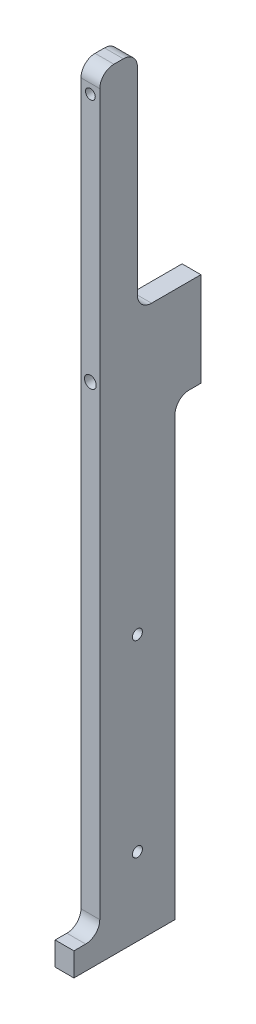
ISO-10303-21;
HEADER;
FILE_DESCRIPTION(('STEP AP214'),'2;1');
FILE_NAME('part.step','',(''),(''),'','','');
FILE_SCHEMA(('AUTOMOTIVE_DESIGN { 1 0 10303 214 1 1 1 1 }'));
ENDSEC;
DATA;
#1=APPLICATION_CONTEXT('core data for automotive mechanical design processes');
#2=APPLICATION_PROTOCOL_DEFINITION('international standard','automotive_design',2000,#1);
#3=PRODUCT_CONTEXT('',#1,'mechanical');
#4=PRODUCT('Part','Part','',(#3));
#5=PRODUCT_RELATED_PRODUCT_CATEGORY('part','',(#4));
#6=PRODUCT_DEFINITION_FORMATION('','',#4);
#7=PRODUCT_DEFINITION_CONTEXT('part definition',#1,'design');
#8=PRODUCT_DEFINITION('design','',#6,#7);
#9=PRODUCT_DEFINITION_SHAPE('','',#8);
#10=(LENGTH_UNIT() NAMED_UNIT(*) SI_UNIT(.MILLI.,.METRE.));
#11=(NAMED_UNIT(*) PLANE_ANGLE_UNIT() SI_UNIT($,.RADIAN.));
#12=(NAMED_UNIT(*) SI_UNIT($,.STERADIAN.) SOLID_ANGLE_UNIT());
#13=UNCERTAINTY_MEASURE_WITH_UNIT(LENGTH_MEASURE(1.E-05),#10,'distance_accuracy_value','');
#14=(GEOMETRIC_REPRESENTATION_CONTEXT(3) GLOBAL_UNCERTAINTY_ASSIGNED_CONTEXT((#13)) GLOBAL_UNIT_ASSIGNED_CONTEXT((#10,
#11,#12)) REPRESENTATION_CONTEXT('',''));
#15=CARTESIAN_POINT('',(0.,0.,0.));
#16=DIRECTION('',(0.,0.,1.));
#17=DIRECTION('',(1.,0.,0.));
#18=AXIS2_PLACEMENT_3D('',#15,#16,#17);
#19=CARTESIAN_POINT('',(6.35,336.55,-42.8625));
#20=DIRECTION('',(0.,0.,-1.));
#21=DIRECTION('',(-1.,0.,0.));
#22=AXIS2_PLACEMENT_3D('',#19,#20,#21);
#23=CYLINDRICAL_SURFACE('',#22,3.96875);
#24=CARTESIAN_POINT('',(6.35,336.55,25.4));
#25=DIRECTION('',(0.,0.,-1.));
#26=DIRECTION('',(-1.,0.,0.));
#27=AXIS2_PLACEMENT_3D('',#24,#25,#26);
#28=CIRCLE('',#27,3.96875);
#29=CARTESIAN_POINT('',(2.38125,336.55,25.4));
#30=VERTEX_POINT('',#29);
#31=EDGE_CURVE('E178',#30,#30,#28,.T.);
#32=ORIENTED_EDGE('',*,*,#31,.F.);
#33=EDGE_LOOP('',(#32));
#34=FACE_BOUND('',#33,.T.);
#35=CARTESIAN_POINT('',(6.35,336.55,-42.8625));
#36=DIRECTION('',(0.,0.,-1.));
#37=DIRECTION('',(-1.,0.,0.));
#38=AXIS2_PLACEMENT_3D('',#35,#36,#37);
#39=CIRCLE('',#38,3.96875);
#40=CARTESIAN_POINT('',(2.38125,336.55,-42.8625));
#41=VERTEX_POINT('',#40);
#42=EDGE_CURVE('E136',#41,#41,#39,.F.);
#43=ORIENTED_EDGE('',*,*,#42,.F.);
#44=EDGE_LOOP('',(#43));
#45=FACE_BOUND('',#44,.T.);
#46=ADVANCED_FACE('F16',(#34,#45),#23,.F.);
#47=CARTESIAN_POINT('',(6.35,504.825,0.));
#48=DIRECTION('',(0.,0.,1.));
#49=DIRECTION('',(1.,0.,0.));
#50=AXIS2_PLACEMENT_3D('',#47,#48,#49);
#51=CYLINDRICAL_SURFACE('',#50,3.302);
#52=CARTESIAN_POINT('',(6.35,504.825,25.4));
#53=DIRECTION('',(0.,0.,1.));
#54=DIRECTION('',(1.,0.,0.));
#55=AXIS2_PLACEMENT_3D('',#52,#53,#54);
#56=CIRCLE('',#55,3.302);
#57=CARTESIAN_POINT('',(9.652,504.825,25.4));
#58=VERTEX_POINT('',#57);
#59=EDGE_CURVE('E221',#58,#58,#56,.F.);
#60=ORIENTED_EDGE('',*,*,#59,.F.);
#61=EDGE_LOOP('',(#60));
#62=FACE_BOUND('',#61,.T.);
#63=CARTESIAN_POINT('',(6.35,504.825,0.));
#64=DIRECTION('',(0.,0.,1.));
#65=DIRECTION('',(1.,0.,0.));
#66=AXIS2_PLACEMENT_3D('',#63,#64,#65);
#67=CIRCLE('',#66,3.302);
#68=CARTESIAN_POINT('',(9.652,504.825,0.));
#69=VERTEX_POINT('',#68);
#70=EDGE_CURVE('E209',#69,#69,#67,.T.);
#71=ORIENTED_EDGE('',*,*,#70,.F.);
#72=EDGE_LOOP('',(#71));
#73=FACE_BOUND('',#72,.T.);
#74=ADVANCED_FACE('F231',(#62,#73),#51,.F.);
#75=CARTESIAN_POINT('',(12.7,0.,0.));
#76=DIRECTION('',(1.,0.,0.));
#77=DIRECTION('',(0.,0.,-1.));
#78=AXIS2_PLACEMENT_3D('',#75,#76,#77);
#79=PLANE('',#78);
#80=CARTESIAN_POINT('',(12.7,52.3875,0.));
#81=DIRECTION('',(1.,0.,0.));
#82=DIRECTION('',(0.,0.,-1.));
#83=AXIS2_PLACEMENT_3D('',#80,#81,#82);
#84=CIRCLE('',#83,3.3655);
#85=CARTESIAN_POINT('',(12.7,52.3875,-3.3655));
#86=VERTEX_POINT('',#85);
#87=EDGE_CURVE('E201',#86,#86,#84,.F.);
#88=ORIENTED_EDGE('',*,*,#87,.T.);
#89=EDGE_LOOP('',(#88));
#90=FACE_BOUND('',#89,.T.);
#91=CARTESIAN_POINT('',(12.7,179.3875,0.));
#92=DIRECTION('',(1.,0.,0.));
#93=DIRECTION('',(0.,0.,-1.));
#94=AXIS2_PLACEMENT_3D('',#91,#92,#93);
#95=CIRCLE('',#94,3.3655);
#96=CARTESIAN_POINT('',(12.7,179.3875,-3.3655));
#97=VERTEX_POINT('',#96);
#98=EDGE_CURVE('E204',#97,#97,#95,.F.);
#99=ORIENTED_EDGE('',*,*,#98,.T.);
#100=EDGE_LOOP('',(#99));
#101=FACE_BOUND('',#100,.T.);
#102=CARTESIAN_POINT('',(12.7,377.825,-9.525));
#103=DIRECTION('',(-1.,0.,0.));
#104=DIRECTION('',(0.,0.,1.));
#105=AXIS2_PLACEMENT_3D('',#102,#103,#104);
#106=CIRCLE('',#105,9.525);
#107=CARTESIAN_POINT('',(12.7,368.3,-9.525));
#108=VERTEX_POINT('',#107);
#109=CARTESIAN_POINT('',(12.7,377.825,0.));
#110=VERTEX_POINT('',#109);
#111=EDGE_CURVE('E212',#108,#110,#106,.T.);
#112=ORIENTED_EDGE('',*,*,#111,.T.);
#113=DIRECTION('',(0.,1.,0.));
#114=VECTOR('',#113,1.);
#115=CARTESIAN_POINT('',(12.7,368.3,0.));
#116=LINE('',#115,#114);
#117=CARTESIAN_POINT('',(12.7,511.175,0.));
#118=VERTEX_POINT('',#117);
#119=EDGE_CURVE('E128',#118,#110,#116,.F.);
#120=ORIENTED_EDGE('',*,*,#119,.F.);
#121=CARTESIAN_POINT('',(12.7,511.175,9.525));
#122=DIRECTION('',(-1.,0.,0.));
#123=DIRECTION('',(0.,0.,1.));
#124=AXIS2_PLACEMENT_3D('',#121,#122,#123);
#125=CIRCLE('',#124,9.525);
#126=CARTESIAN_POINT('',(12.7,520.7,9.525));
#127=VERTEX_POINT('',#126);
#128=EDGE_CURVE('E115',#127,#118,#125,.T.);
#129=ORIENTED_EDGE('',*,*,#128,.F.);
#130=DIRECTION('',(0.,0.,1.));
#131=VECTOR('',#130,1.);
#132=CARTESIAN_POINT('',(12.7,520.7,0.));
#133=LINE('',#132,#131);
#134=CARTESIAN_POINT('',(12.7,520.7,15.875));
#135=VERTEX_POINT('',#134);
#136=EDGE_CURVE('E110',#135,#127,#133,.F.);
#137=ORIENTED_EDGE('',*,*,#136,.F.);
#138=CARTESIAN_POINT('',(12.7,511.175,15.875));
#139=DIRECTION('',(-1.,0.,0.));
#140=DIRECTION('',(0.,0.,1.));
#141=AXIS2_PLACEMENT_3D('',#138,#139,#140);
#142=CIRCLE('',#141,9.525);
#143=CARTESIAN_POINT('',(12.7,511.175,25.4));
#144=VERTEX_POINT('',#143);
#145=EDGE_CURVE('E19',#144,#135,#142,.T.);
#146=ORIENTED_EDGE('',*,*,#145,.F.);
#147=DIRECTION('',(0.,1.,0.));
#148=VECTOR('',#147,1.);
#149=CARTESIAN_POINT('',(12.7,520.7,25.4));
#150=LINE('',#149,#148);
#151=CARTESIAN_POINT('',(12.7,25.4,25.4));
#152=VERTEX_POINT('',#151);
#153=EDGE_CURVE('E124',#152,#144,#150,.T.);
#154=ORIENTED_EDGE('',*,*,#153,.F.);
#155=CARTESIAN_POINT('',(12.7,25.4,34.925));
#156=DIRECTION('',(-1.,0.,0.));
#157=DIRECTION('',(0.,0.,1.));
#158=AXIS2_PLACEMENT_3D('',#155,#156,#157);
#159=CIRCLE('',#158,9.525);
#160=CARTESIAN_POINT('',(12.7,15.875,34.925));
#161=VERTEX_POINT('',#160);
#162=EDGE_CURVE('E218',#152,#161,#159,.T.);
#163=ORIENTED_EDGE('',*,*,#162,.T.);
#164=DIRECTION('',(0.,0.,-1.));
#165=VECTOR('',#164,1.);
#166=CARTESIAN_POINT('',(12.7,15.875,42.8625));
#167=LINE('',#166,#165);
#168=CARTESIAN_POINT('',(12.7,15.875,42.8625));
#169=VERTEX_POINT('',#168);
#170=EDGE_CURVE('E171',#161,#169,#167,.F.);
#171=ORIENTED_EDGE('',*,*,#170,.T.);
#172=DIRECTION('',(0.,1.,0.));
#173=VECTOR('',#172,1.);
#174=CARTESIAN_POINT('',(12.7,368.3,42.8625));
#175=LINE('',#174,#173);
#176=CARTESIAN_POINT('',(12.7,0.,42.8625));
#177=VERTEX_POINT('',#176);
#178=EDGE_CURVE('E163',#177,#169,#175,.T.);
#179=ORIENTED_EDGE('',*,*,#178,.F.);
#180=DIRECTION('',(0.,0.,-1.));
#181=VECTOR('',#180,1.);
#182=CARTESIAN_POINT('',(12.7,0.,42.8625));
#183=LINE('',#182,#181);
#184=CARTESIAN_POINT('',(12.7,0.,-25.4));
#185=VERTEX_POINT('',#184);
#186=EDGE_CURVE('E159',#185,#177,#183,.F.);
#187=ORIENTED_EDGE('',*,*,#186,.F.);
#188=DIRECTION('',(0.,1.,0.));
#189=VECTOR('',#188,1.);
#190=CARTESIAN_POINT('',(12.7,304.8,-25.4));
#191=LINE('',#190,#189);
#192=CARTESIAN_POINT('',(12.7,295.275,-25.4));
#193=VERTEX_POINT('',#192);
#194=EDGE_CURVE('E152',#185,#193,#191,.T.);
#195=ORIENTED_EDGE('',*,*,#194,.T.);
#196=CARTESIAN_POINT('',(12.7,295.275,-34.925));
#197=DIRECTION('',(-1.,0.,0.));
#198=DIRECTION('',(0.,0.,1.));
#199=AXIS2_PLACEMENT_3D('',#196,#197,#198);
#200=CIRCLE('',#199,9.525);
#201=CARTESIAN_POINT('',(12.7,304.8,-34.925));
#202=VERTEX_POINT('',#201);
#203=EDGE_CURVE('E155',#193,#202,#200,.T.);
#204=ORIENTED_EDGE('',*,*,#203,.T.);
#205=DIRECTION('',(0.,0.,1.));
#206=VECTOR('',#205,1.);
#207=CARTESIAN_POINT('',(12.7,304.8,-42.8625));
#208=LINE('',#207,#206);
#209=CARTESIAN_POINT('',(12.7,304.8,-42.8625));
#210=VERTEX_POINT('',#209);
#211=EDGE_CURVE('E145',#202,#210,#208,.F.);
#212=ORIENTED_EDGE('',*,*,#211,.T.);
#213=DIRECTION('',(0.,1.,0.));
#214=VECTOR('',#213,1.);
#215=CARTESIAN_POINT('',(12.7,0.,-42.8625));
#216=LINE('',#215,#214);
#217=CARTESIAN_POINT('',(12.7,368.3,-42.8625));
#218=VERTEX_POINT('',#217);
#219=EDGE_CURVE('E139',#218,#210,#216,.F.);
#220=ORIENTED_EDGE('',*,*,#219,.F.);
#221=DIRECTION('',(0.,0.,1.));
#222=VECTOR('',#221,1.);
#223=CARTESIAN_POINT('',(12.7,368.3,-42.8625));
#224=LINE('',#223,#222);
#225=EDGE_CURVE('E132',#108,#218,#224,.F.);
#226=ORIENTED_EDGE('',*,*,#225,.F.);
#227=EDGE_LOOP('',(#112,#120,#129,#137,#146,#154,#163,#171,#179,#187,#195,#204,#212,#220,#226));
#228=FACE_BOUND('',#227,.T.);
#229=ADVANCED_FACE('F113',(#90,#101,#228),#79,.T.);
#230=CARTESIAN_POINT('',(12.7,520.7,0.));
#231=DIRECTION('',(0.,1.,0.));
#232=DIRECTION('',(0.,0.,1.));
#233=AXIS2_PLACEMENT_3D('',#230,#231,#232);
#234=PLANE('',#233);
#235=DIRECTION('',(-1.,0.,0.));
#236=VECTOR('',#235,1.);
#237=CARTESIAN_POINT('',(29.25572,520.7,15.875));
#238=LINE('',#237,#236);
#239=CARTESIAN_POINT('',(0.,520.7,15.875));
#240=VERTEX_POINT('',#239);
#241=EDGE_CURVE('E107',#135,#240,#238,.T.);
#242=ORIENTED_EDGE('',*,*,#241,.F.);
#243=ORIENTED_EDGE('',*,*,#136,.T.);
#244=DIRECTION('',(-1.,0.,0.));
#245=VECTOR('',#244,1.);
#246=CARTESIAN_POINT('',(29.25572,520.7,9.525));
#247=LINE('',#246,#245);
#248=CARTESIAN_POINT('',(0.,520.7,9.525));
#249=VERTEX_POINT('',#248);
#250=EDGE_CURVE('E208',#249,#127,#247,.F.);
#251=ORIENTED_EDGE('',*,*,#250,.F.);
#252=DIRECTION('',(0.,0.,-1.));
#253=VECTOR('',#252,1.);
#254=CARTESIAN_POINT('',(0.,520.7,0.));
#255=LINE('',#254,#253);
#256=EDGE_CURVE('E122',#249,#240,#255,.F.);
#257=ORIENTED_EDGE('',*,*,#256,.T.);
#258=EDGE_LOOP('',(#242,#243,#251,#257));
#259=FACE_BOUND('',#258,.T.);
#260=ADVANCED_FACE('F121',(#259),#234,.T.);
#261=CARTESIAN_POINT('',(29.25572,511.175,15.875));
#262=DIRECTION('',(-1.,0.,0.));
#263=DIRECTION('',(0.,0.,1.));
#264=AXIS2_PLACEMENT_3D('',#261,#262,#263);
#265=CYLINDRICAL_SURFACE('',#264,9.525);
#266=ORIENTED_EDGE('',*,*,#145,.T.);
#267=ORIENTED_EDGE('',*,*,#241,.T.);
#268=CARTESIAN_POINT('',(0.,511.175,15.875));
#269=DIRECTION('',(-1.,0.,0.));
#270=DIRECTION('',(0.,0.,1.));
#271=AXIS2_PLACEMENT_3D('',#268,#269,#270);
#272=CIRCLE('',#271,9.525);
#273=CARTESIAN_POINT('',(0.,511.175,25.4));
#274=VERTEX_POINT('',#273);
#275=EDGE_CURVE('E199',#240,#274,#272,.F.);
#276=ORIENTED_EDGE('',*,*,#275,.T.);
#277=DIRECTION('',(1.,0.,0.));
#278=VECTOR('',#277,1.);
#279=CARTESIAN_POINT('',(12.7,511.175,25.4));
#280=LINE('',#279,#278);
#281=EDGE_CURVE('E109',#144,#274,#280,.F.);
#282=ORIENTED_EDGE('',*,*,#281,.F.);
#283=EDGE_LOOP('',(#266,#267,#276,#282));
#284=FACE_BOUND('',#283,.T.);
#285=ADVANCED_FACE('F104',(#284),#265,.T.);
#286=CARTESIAN_POINT('',(12.7,520.7,25.4));
#287=DIRECTION('',(0.,0.,1.));
#288=DIRECTION('',(1.,0.,0.));
#289=AXIS2_PLACEMENT_3D('',#286,#287,#288);
#290=PLANE('',#289);
#291=ORIENTED_EDGE('',*,*,#59,.T.);
#292=EDGE_LOOP('',(#291));
#293=FACE_BOUND('',#292,.T.);
#294=ORIENTED_EDGE('',*,*,#31,.T.);
#295=EDGE_LOOP('',(#294));
#296=FACE_BOUND('',#295,.T.);
#297=DIRECTION('',(-1.,0.,0.));
#298=VECTOR('',#297,1.);
#299=CARTESIAN_POINT('',(29.25572,25.4,25.4));
#300=LINE('',#299,#298);
#301=CARTESIAN_POINT('',(0.,25.4,25.4));
#302=VERTEX_POINT('',#301);
#303=EDGE_CURVE('E175',#302,#152,#300,.F.);
#304=ORIENTED_EDGE('',*,*,#303,.T.);
#305=ORIENTED_EDGE('',*,*,#153,.T.);
#306=ORIENTED_EDGE('',*,*,#281,.T.);
#307=DIRECTION('',(0.,1.,0.));
#308=VECTOR('',#307,1.);
#309=CARTESIAN_POINT('',(0.,0.,25.4));
#310=LINE('',#309,#308);
#311=EDGE_CURVE('E198',#274,#302,#310,.F.);
#312=ORIENTED_EDGE('',*,*,#311,.T.);
#313=EDGE_LOOP('',(#304,#305,#306,#312));
#314=FACE_BOUND('',#313,.T.);
#315=ADVANCED_FACE('F226',(#293,#296,#314),#290,.T.);
#316=CARTESIAN_POINT('',(29.25572,25.4,34.925));
#317=DIRECTION('',(-1.,0.,0.));
#318=DIRECTION('',(0.,0.,1.));
#319=AXIS2_PLACEMENT_3D('',#316,#317,#318);
#320=CYLINDRICAL_SURFACE('',#319,9.525);
#321=CARTESIAN_POINT('',(0.,25.4,34.925));
#322=DIRECTION('',(-1.,0.,0.));
#323=DIRECTION('',(0.,0.,1.));
#324=AXIS2_PLACEMENT_3D('',#321,#322,#323);
#325=CIRCLE('',#324,9.525);
#326=CARTESIAN_POINT('',(0.,15.875,34.925));
#327=VERTEX_POINT('',#326);
#328=EDGE_CURVE('E194',#302,#327,#325,.T.);
#329=ORIENTED_EDGE('',*,*,#328,.T.);
#330=DIRECTION('',(1.,0.,0.));
#331=VECTOR('',#330,1.);
#332=CARTESIAN_POINT('',(12.7,15.875,34.925));
#333=LINE('',#332,#331);
#334=EDGE_CURVE('E174',#327,#161,#333,.T.);
#335=ORIENTED_EDGE('',*,*,#334,.T.);
#336=ORIENTED_EDGE('',*,*,#162,.F.);
#337=ORIENTED_EDGE('',*,*,#303,.F.);
#338=EDGE_LOOP('',(#329,#335,#336,#337));
#339=FACE_BOUND('',#338,.T.);
#340=ADVANCED_FACE('F296',(#339),#320,.F.);
#341=CARTESIAN_POINT('',(12.7,15.875,42.8625));
#342=DIRECTION('',(0.,-1.,0.));
#343=DIRECTION('',(0.,0.,-1.));
#344=AXIS2_PLACEMENT_3D('',#341,#342,#343);
#345=PLANE('',#344);
#346=DIRECTION('',(0.,0.,-1.));
#347=VECTOR('',#346,1.);
#348=CARTESIAN_POINT('',(0.,15.875,0.));
#349=LINE('',#348,#347);
#350=CARTESIAN_POINT('',(0.,15.875,42.8625));
#351=VERTEX_POINT('',#350);
#352=EDGE_CURVE('E197',#327,#351,#349,.F.);
#353=ORIENTED_EDGE('',*,*,#352,.T.);
#354=DIRECTION('',(1.,0.,0.));
#355=VECTOR('',#354,1.);
#356=CARTESIAN_POINT('',(0.,15.875,42.8625));
#357=LINE('',#356,#355);
#358=EDGE_CURVE('E168',#169,#351,#357,.F.);
#359=ORIENTED_EDGE('',*,*,#358,.F.);
#360=ORIENTED_EDGE('',*,*,#170,.F.);
#361=ORIENTED_EDGE('',*,*,#334,.F.);
#362=EDGE_LOOP('',(#353,#359,#360,#361));
#363=FACE_BOUND('',#362,.T.);
#364=ADVANCED_FACE('F354',(#363),#345,.F.);
#365=CARTESIAN_POINT('',(0.,368.3,42.8625));
#366=DIRECTION('',(0.,0.,1.));
#367=DIRECTION('',(1.,0.,0.));
#368=AXIS2_PLACEMENT_3D('',#365,#366,#367);
#369=PLANE('',#368);
#370=DIRECTION('',(1.,0.,0.));
#371=VECTOR('',#370,1.);
#372=CARTESIAN_POINT('',(0.,0.,42.8625));
#373=LINE('',#372,#371);
#374=CARTESIAN_POINT('',(0.,0.,42.8625));
#375=VERTEX_POINT('',#374);
#376=EDGE_CURVE('E162',#177,#375,#373,.F.);
#377=ORIENTED_EDGE('',*,*,#376,.F.);
#378=ORIENTED_EDGE('',*,*,#178,.T.);
#379=ORIENTED_EDGE('',*,*,#358,.T.);
#380=DIRECTION('',(0.,1.,0.));
#381=VECTOR('',#380,1.);
#382=CARTESIAN_POINT('',(0.,0.,42.8625));
#383=LINE('',#382,#381);
#384=EDGE_CURVE('E275',#351,#375,#383,.F.);
#385=ORIENTED_EDGE('',*,*,#384,.T.);
#386=EDGE_LOOP('',(#377,#378,#379,#385));
#387=FACE_BOUND('',#386,.T.);
#388=ADVANCED_FACE('F351',(#387),#369,.T.);
#389=CARTESIAN_POINT('',(0.,0.,42.8625));
#390=DIRECTION('',(0.,-1.,0.));
#391=DIRECTION('',(0.,0.,-1.));
#392=AXIS2_PLACEMENT_3D('',#389,#390,#391);
#393=PLANE('',#392);
#394=ORIENTED_EDGE('',*,*,#376,.T.);
#395=DIRECTION('',(0.,0.,-1.));
#396=VECTOR('',#395,1.);
#397=CARTESIAN_POINT('',(0.,0.,0.));
#398=LINE('',#397,#396);
#399=CARTESIAN_POINT('',(0.,0.,-25.4));
#400=VERTEX_POINT('',#399);
#401=EDGE_CURVE('E272',#375,#400,#398,.T.);
#402=ORIENTED_EDGE('',*,*,#401,.T.);
#403=DIRECTION('',(1.,0.,0.));
#404=VECTOR('',#403,1.);
#405=CARTESIAN_POINT('',(12.7,0.,-25.4));
#406=LINE('',#405,#404);
#407=EDGE_CURVE('E156',#400,#185,#406,.T.);
#408=ORIENTED_EDGE('',*,*,#407,.T.);
#409=ORIENTED_EDGE('',*,*,#186,.T.);
#410=EDGE_LOOP('',(#394,#402,#408,#409));
#411=FACE_BOUND('',#410,.T.);
#412=ADVANCED_FACE('F344',(#411),#393,.T.);
#413=CARTESIAN_POINT('',(12.7,304.8,-25.4));
#414=DIRECTION('',(0.,0.,1.));
#415=DIRECTION('',(1.,0.,0.));
#416=AXIS2_PLACEMENT_3D('',#413,#414,#415);
#417=PLANE('',#416);
#418=ORIENTED_EDGE('',*,*,#194,.F.);
#419=ORIENTED_EDGE('',*,*,#407,.F.);
#420=DIRECTION('',(0.,1.,0.));
#421=VECTOR('',#420,1.);
#422=CARTESIAN_POINT('',(0.,0.,-25.4));
#423=LINE('',#422,#421);
#424=CARTESIAN_POINT('',(0.,295.275,-25.4));
#425=VERTEX_POINT('',#424);
#426=EDGE_CURVE('E193',#400,#425,#423,.T.);
#427=ORIENTED_EDGE('',*,*,#426,.T.);
#428=DIRECTION('',(-1.,0.,0.));
#429=VECTOR('',#428,1.);
#430=CARTESIAN_POINT('',(29.25572,295.275,-25.4));
#431=LINE('',#430,#429);
#432=EDGE_CURVE('E149',#425,#193,#431,.F.);
#433=ORIENTED_EDGE('',*,*,#432,.T.);
#434=EDGE_LOOP('',(#418,#419,#427,#433));
#435=FACE_BOUND('',#434,.T.);
#436=ADVANCED_FACE('F338',(#435),#417,.F.);
#437=CARTESIAN_POINT('',(29.25572,295.275,-34.925));
#438=DIRECTION('',(-1.,0.,0.));
#439=DIRECTION('',(0.,0.,1.));
#440=AXIS2_PLACEMENT_3D('',#437,#438,#439);
#441=CYLINDRICAL_SURFACE('',#440,9.525);
#442=CARTESIAN_POINT('',(0.,295.275,-34.925));
#443=DIRECTION('',(-1.,0.,0.));
#444=DIRECTION('',(0.,0.,1.));
#445=AXIS2_PLACEMENT_3D('',#442,#443,#444);
#446=CIRCLE('',#445,9.525);
#447=CARTESIAN_POINT('',(0.,304.8,-34.925));
#448=VERTEX_POINT('',#447);
#449=EDGE_CURVE('E189',#425,#448,#446,.T.);
#450=ORIENTED_EDGE('',*,*,#449,.T.);
#451=DIRECTION('',(1.,0.,0.));
#452=VECTOR('',#451,1.);
#453=CARTESIAN_POINT('',(12.7,304.8,-34.925));
#454=LINE('',#453,#452);
#455=EDGE_CURVE('E148',#448,#202,#454,.T.);
#456=ORIENTED_EDGE('',*,*,#455,.T.);
#457=ORIENTED_EDGE('',*,*,#203,.F.);
#458=ORIENTED_EDGE('',*,*,#432,.F.);
#459=EDGE_LOOP('',(#450,#456,#457,#458));
#460=FACE_BOUND('',#459,.T.);
#461=ADVANCED_FACE('F356',(#460),#441,.F.);
#462=CARTESIAN_POINT('',(12.7,304.8,-42.8625));
#463=DIRECTION('',(0.,1.,0.));
#464=DIRECTION('',(0.,0.,1.));
#465=AXIS2_PLACEMENT_3D('',#462,#463,#464);
#466=PLANE('',#465);
#467=DIRECTION('',(0.,0.,-1.));
#468=VECTOR('',#467,1.);
#469=CARTESIAN_POINT('',(0.,304.8,0.));
#470=LINE('',#469,#468);
#471=CARTESIAN_POINT('',(0.,304.8,-42.8625));
#472=VERTEX_POINT('',#471);
#473=EDGE_CURVE('E192',#448,#472,#470,.T.);
#474=ORIENTED_EDGE('',*,*,#473,.T.);
#475=DIRECTION('',(-1.,0.,0.));
#476=VECTOR('',#475,1.);
#477=CARTESIAN_POINT('',(0.,304.8,-42.8625));
#478=LINE('',#477,#476);
#479=EDGE_CURVE('E142',#210,#472,#478,.T.);
#480=ORIENTED_EDGE('',*,*,#479,.F.);
#481=ORIENTED_EDGE('',*,*,#211,.F.);
#482=ORIENTED_EDGE('',*,*,#455,.F.);
#483=EDGE_LOOP('',(#474,#480,#481,#482));
#484=FACE_BOUND('',#483,.T.);
#485=ADVANCED_FACE('F238',(#484),#466,.F.);
#486=CARTESIAN_POINT('',(0.,0.,-42.8625));
#487=DIRECTION('',(0.,0.,-1.));
#488=DIRECTION('',(-1.,0.,0.));
#489=AXIS2_PLACEMENT_3D('',#486,#487,#488);
#490=PLANE('',#489);
#491=ORIENTED_EDGE('',*,*,#42,.T.);
#492=EDGE_LOOP('',(#491));
#493=FACE_BOUND('',#492,.T.);
#494=DIRECTION('',(1.,0.,0.));
#495=VECTOR('',#494,1.);
#496=CARTESIAN_POINT('',(0.,368.3,-42.8625));
#497=LINE('',#496,#495);
#498=CARTESIAN_POINT('',(0.,368.3,-42.8625));
#499=VERTEX_POINT('',#498);
#500=EDGE_CURVE('E135',#218,#499,#497,.F.);
#501=ORIENTED_EDGE('',*,*,#500,.F.);
#502=ORIENTED_EDGE('',*,*,#219,.T.);
#503=ORIENTED_EDGE('',*,*,#479,.T.);
#504=DIRECTION('',(0.,1.,0.));
#505=VECTOR('',#504,1.);
#506=CARTESIAN_POINT('',(0.,0.,-42.8625));
#507=LINE('',#506,#505);
#508=EDGE_CURVE('E247',#472,#499,#507,.T.);
#509=ORIENTED_EDGE('',*,*,#508,.T.);
#510=EDGE_LOOP('',(#501,#502,#503,#509));
#511=FACE_BOUND('',#510,.T.);
#512=ADVANCED_FACE('F234',(#493,#511),#490,.T.);
#513=CARTESIAN_POINT('',(0.,368.3,-42.8625));
#514=DIRECTION('',(0.,1.,0.));
#515=DIRECTION('',(0.,0.,1.));
#516=AXIS2_PLACEMENT_3D('',#513,#514,#515);
#517=PLANE('',#516);
#518=ORIENTED_EDGE('',*,*,#500,.T.);
#519=DIRECTION('',(0.,0.,-1.));
#520=VECTOR('',#519,1.);
#521=CARTESIAN_POINT('',(0.,368.3,0.));
#522=LINE('',#521,#520);
#523=CARTESIAN_POINT('',(0.,368.3,-9.525));
#524=VERTEX_POINT('',#523);
#525=EDGE_CURVE('E188',#499,#524,#522,.F.);
#526=ORIENTED_EDGE('',*,*,#525,.T.);
#527=DIRECTION('',(-1.,0.,0.));
#528=VECTOR('',#527,1.);
#529=CARTESIAN_POINT('',(29.25572,368.3,-9.525));
#530=LINE('',#529,#528);
#531=EDGE_CURVE('E130',#524,#108,#530,.F.);
#532=ORIENTED_EDGE('',*,*,#531,.T.);
#533=ORIENTED_EDGE('',*,*,#225,.T.);
#534=EDGE_LOOP('',(#518,#526,#532,#533));
#535=FACE_BOUND('',#534,.T.);
#536=ADVANCED_FACE('F237',(#535),#517,.T.);
#537=CARTESIAN_POINT('',(29.25572,377.825,-9.525));
#538=DIRECTION('',(-1.,0.,0.));
#539=DIRECTION('',(0.,0.,1.));
#540=AXIS2_PLACEMENT_3D('',#537,#538,#539);
#541=CYLINDRICAL_SURFACE('',#540,9.525);
#542=CARTESIAN_POINT('',(0.,377.825,-9.525));
#543=DIRECTION('',(-1.,0.,0.));
#544=DIRECTION('',(0.,0.,1.));
#545=AXIS2_PLACEMENT_3D('',#542,#543,#544);
#546=CIRCLE('',#545,9.525);
#547=CARTESIAN_POINT('',(0.,377.825,0.));
#548=VERTEX_POINT('',#547);
#549=EDGE_CURVE('E185',#524,#548,#546,.T.);
#550=ORIENTED_EDGE('',*,*,#549,.T.);
#551=DIRECTION('',(-1.,0.,0.));
#552=VECTOR('',#551,1.);
#553=CARTESIAN_POINT('',(12.7,377.825,0.));
#554=LINE('',#553,#552);
#555=EDGE_CURVE('E129',#110,#548,#554,.T.);
#556=ORIENTED_EDGE('',*,*,#555,.F.);
#557=ORIENTED_EDGE('',*,*,#111,.F.);
#558=ORIENTED_EDGE('',*,*,#531,.F.);
#559=EDGE_LOOP('',(#550,#556,#557,#558));
#560=FACE_BOUND('',#559,.T.);
#561=ADVANCED_FACE('F323',(#560),#541,.F.);
#562=CARTESIAN_POINT('',(12.7,368.3,0.));
#563=DIRECTION('',(0.,0.,-1.));
#564=DIRECTION('',(-1.,0.,0.));
#565=AXIS2_PLACEMENT_3D('',#562,#563,#564);
#566=PLANE('',#565);
#567=ORIENTED_EDGE('',*,*,#70,.T.);
#568=EDGE_LOOP('',(#567));
#569=FACE_BOUND('',#568,.T.);
#570=ORIENTED_EDGE('',*,*,#555,.T.);
#571=DIRECTION('',(0.,1.,0.));
#572=VECTOR('',#571,1.);
#573=CARTESIAN_POINT('',(0.,0.,0.));
#574=LINE('',#573,#572);
#575=CARTESIAN_POINT('',(0.,511.175,0.));
#576=VERTEX_POINT('',#575);
#577=EDGE_CURVE('E184',#548,#576,#574,.T.);
#578=ORIENTED_EDGE('',*,*,#577,.T.);
#579=DIRECTION('',(-1.,0.,0.));
#580=VECTOR('',#579,1.);
#581=CARTESIAN_POINT('',(29.25572,511.175,0.));
#582=LINE('',#581,#580);
#583=EDGE_CURVE('E34',#118,#576,#582,.T.);
#584=ORIENTED_EDGE('',*,*,#583,.F.);
#585=ORIENTED_EDGE('',*,*,#119,.T.);
#586=EDGE_LOOP('',(#570,#578,#584,#585));
#587=FACE_BOUND('',#586,.T.);
#588=ADVANCED_FACE('F319',(#569,#587),#566,.T.);
#589=CARTESIAN_POINT('',(29.25572,511.175,9.525));
#590=DIRECTION('',(-1.,0.,0.));
#591=DIRECTION('',(0.,0.,1.));
#592=AXIS2_PLACEMENT_3D('',#589,#590,#591);
#593=CYLINDRICAL_SURFACE('',#592,9.525);
#594=ORIENTED_EDGE('',*,*,#128,.T.);
#595=ORIENTED_EDGE('',*,*,#583,.T.);
#596=CARTESIAN_POINT('',(0.,511.175,9.525));
#597=DIRECTION('',(-1.,0.,0.));
#598=DIRECTION('',(0.,0.,1.));
#599=AXIS2_PLACEMENT_3D('',#596,#597,#598);
#600=CIRCLE('',#599,9.525);
#601=EDGE_CURVE('E182',#576,#249,#600,.F.);
#602=ORIENTED_EDGE('',*,*,#601,.T.);
#603=ORIENTED_EDGE('',*,*,#250,.T.);
#604=EDGE_LOOP('',(#594,#595,#602,#603));
#605=FACE_BOUND('',#604,.T.);
#606=ADVANCED_FACE('F383',(#605),#593,.T.);
#607=CARTESIAN_POINT('',(12.7,179.3875,0.));
#608=DIRECTION('',(1.,0.,0.));
#609=DIRECTION('',(0.,0.,-1.));
#610=AXIS2_PLACEMENT_3D('',#607,#608,#609);
#611=CYLINDRICAL_SURFACE('',#610,3.3655);
#612=ORIENTED_EDGE('',*,*,#98,.F.);
#613=EDGE_LOOP('',(#612));
#614=FACE_BOUND('',#613,.T.);
#615=CARTESIAN_POINT('',(0.,179.3875,0.));
#616=DIRECTION('',(1.,0.,0.));
#617=DIRECTION('',(0.,0.,-1.));
#618=AXIS2_PLACEMENT_3D('',#615,#616,#617);
#619=CIRCLE('',#618,3.3655);
#620=CARTESIAN_POINT('',(0.,179.3875,-3.3655));
#621=VERTEX_POINT('',#620);
#622=EDGE_CURVE('E25',#621,#621,#619,.F.);
#623=ORIENTED_EDGE('',*,*,#622,.T.);
#624=EDGE_LOOP('',(#623));
#625=FACE_BOUND('',#624,.T.);
#626=ADVANCED_FACE('F375',(#614,#625),#611,.F.);
#627=CARTESIAN_POINT('',(12.7,52.3875,0.));
#628=DIRECTION('',(1.,0.,0.));
#629=DIRECTION('',(0.,0.,-1.));
#630=AXIS2_PLACEMENT_3D('',#627,#628,#629);
#631=CYLINDRICAL_SURFACE('',#630,3.3655);
#632=ORIENTED_EDGE('',*,*,#87,.F.);
#633=EDGE_LOOP('',(#632));
#634=FACE_BOUND('',#633,.T.);
#635=CARTESIAN_POINT('',(0.,52.3875,0.));
#636=DIRECTION('',(1.,0.,0.));
#637=DIRECTION('',(0.,0.,-1.));
#638=AXIS2_PLACEMENT_3D('',#635,#636,#637);
#639=CIRCLE('',#638,3.3655);
#640=CARTESIAN_POINT('',(0.,52.3875,-3.3655));
#641=VERTEX_POINT('',#640);
#642=EDGE_CURVE('E11',#641,#641,#639,.F.);
#643=ORIENTED_EDGE('',*,*,#642,.T.);
#644=EDGE_LOOP('',(#643));
#645=FACE_BOUND('',#644,.T.);
#646=ADVANCED_FACE('F369',(#634,#645),#631,.F.);
#647=CARTESIAN_POINT('',(0.,0.,0.));
#648=DIRECTION('',(1.,0.,0.));
#649=DIRECTION('',(0.,0.,-1.));
#650=AXIS2_PLACEMENT_3D('',#647,#648,#649);
#651=PLANE('',#650);
#652=ORIENTED_EDGE('',*,*,#642,.F.);
#653=EDGE_LOOP('',(#652));
#654=FACE_BOUND('',#653,.T.);
#655=ORIENTED_EDGE('',*,*,#622,.F.);
#656=EDGE_LOOP('',(#655));
#657=FACE_BOUND('',#656,.T.);
#658=ORIENTED_EDGE('',*,*,#577,.F.);
#659=ORIENTED_EDGE('',*,*,#549,.F.);
#660=ORIENTED_EDGE('',*,*,#525,.F.);
#661=ORIENTED_EDGE('',*,*,#508,.F.);
#662=ORIENTED_EDGE('',*,*,#473,.F.);
#663=ORIENTED_EDGE('',*,*,#449,.F.);
#664=ORIENTED_EDGE('',*,*,#426,.F.);
#665=ORIENTED_EDGE('',*,*,#401,.F.);
#666=ORIENTED_EDGE('',*,*,#384,.F.);
#667=ORIENTED_EDGE('',*,*,#352,.F.);
#668=ORIENTED_EDGE('',*,*,#328,.F.);
#669=ORIENTED_EDGE('',*,*,#311,.F.);
#670=ORIENTED_EDGE('',*,*,#275,.F.);
#671=ORIENTED_EDGE('',*,*,#256,.F.);
#672=ORIENTED_EDGE('',*,*,#601,.F.);
#673=EDGE_LOOP('',(#658,#659,#660,#661,#662,#663,#664,#665,#666,#667,#668,#669,#670,#671,#672));
#674=FACE_BOUND('',#673,.T.);
#675=ADVANCED_FACE('F300',(#654,#657,#674),#651,.F.);
#676=CLOSED_SHELL('',(#46,#74,#229,#260,#285,#315,#340,#364,#388,#412,#436,#461,#485,#512,#536,
#561,#588,#606,#626,#646,#675));
#677=MANIFOLD_SOLID_BREP('B1',#676);
#678=ADVANCED_BREP_SHAPE_REPRESENTATION('',(#18,#677),#14);
#679=SHAPE_DEFINITION_REPRESENTATION(#9,#678);
ENDSEC;
END-ISO-10303-21;
